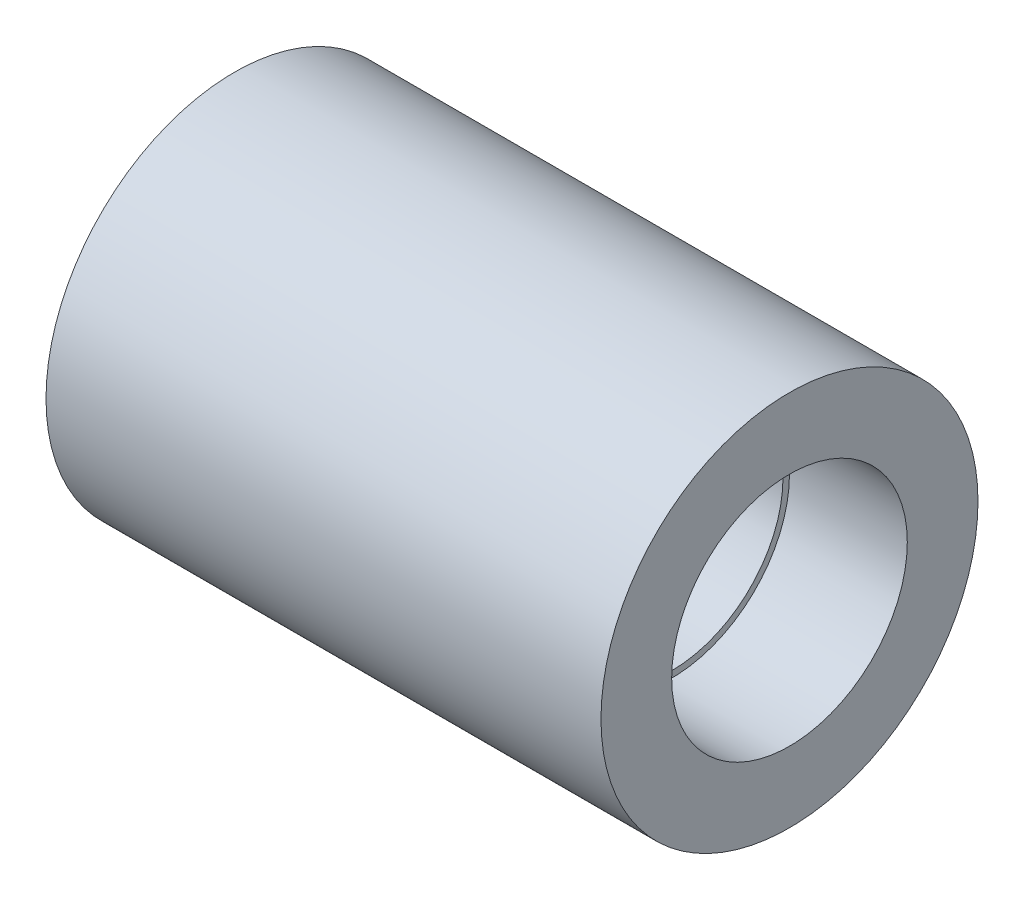
ISO-10303-21;
HEADER;
FILE_DESCRIPTION(('STEP AP214'),'2;1');
FILE_NAME('part.step','',(''),(''),'','','');
FILE_SCHEMA(('AUTOMOTIVE_DESIGN { 1 0 10303 214 1 1 1 1 }'));
ENDSEC;
DATA;
#1=APPLICATION_CONTEXT('core data for automotive mechanical design processes');
#2=APPLICATION_PROTOCOL_DEFINITION('international standard','automotive_design',2000,#1);
#3=PRODUCT_CONTEXT('',#1,'mechanical');
#4=PRODUCT('Part','Part','',(#3));
#5=PRODUCT_RELATED_PRODUCT_CATEGORY('part','',(#4));
#6=PRODUCT_DEFINITION_FORMATION('','',#4);
#7=PRODUCT_DEFINITION_CONTEXT('part definition',#1,'design');
#8=PRODUCT_DEFINITION('design','',#6,#7);
#9=PRODUCT_DEFINITION_SHAPE('','',#8);
#10=(LENGTH_UNIT() NAMED_UNIT(*) SI_UNIT(.MILLI.,.METRE.));
#11=(NAMED_UNIT(*) PLANE_ANGLE_UNIT() SI_UNIT($,.RADIAN.));
#12=(NAMED_UNIT(*) SI_UNIT($,.STERADIAN.) SOLID_ANGLE_UNIT());
#13=UNCERTAINTY_MEASURE_WITH_UNIT(LENGTH_MEASURE(1.E-05),#10,'distance_accuracy_value','');
#14=(GEOMETRIC_REPRESENTATION_CONTEXT(3) GLOBAL_UNCERTAINTY_ASSIGNED_CONTEXT((#13)) GLOBAL_UNIT_ASSIGNED_CONTEXT((#10,
#11,#12)) REPRESENTATION_CONTEXT('',''));
#15=CARTESIAN_POINT('',(0.,0.,0.));
#16=DIRECTION('',(0.,0.,1.));
#17=DIRECTION('',(1.,0.,0.));
#18=AXIS2_PLACEMENT_3D('',#15,#16,#17);
#19=CARTESIAN_POINT('',(3.175,0.,0.));
#20=DIRECTION('',(-1.,0.,0.));
#21=DIRECTION('',(0.,0.,1.));
#22=AXIS2_PLACEMENT_3D('',#19,#20,#21);
#23=CYLINDRICAL_SURFACE('',#22,3.175);
#24=CARTESIAN_POINT('',(3.175,0.,0.));
#25=DIRECTION('',(1.,0.,0.));
#26=DIRECTION('',(0.,0.,-1.));
#27=AXIS2_PLACEMENT_3D('',#24,#25,#26);
#28=CIRCLE('',#27,3.175);
#29=CARTESIAN_POINT('',(3.175,0.,-3.175));
#30=VERTEX_POINT('',#29);
#31=EDGE_CURVE('E46',#30,#30,#28,.T.);
#32=ORIENTED_EDGE('',*,*,#31,.T.);
#33=EDGE_LOOP('',(#32));
#34=FACE_BOUND('',#33,.T.);
#35=CARTESIAN_POINT('',(0.,0.,0.));
#36=DIRECTION('',(1.,0.,0.));
#37=DIRECTION('',(0.,0.,-1.));
#38=AXIS2_PLACEMENT_3D('',#35,#36,#37);
#39=CIRCLE('',#38,3.175);
#40=CARTESIAN_POINT('',(0.,0.,-3.175));
#41=VERTEX_POINT('',#40);
#42=EDGE_CURVE('E45',#41,#41,#39,.T.);
#43=ORIENTED_EDGE('',*,*,#42,.F.);
#44=EDGE_LOOP('',(#43));
#45=FACE_BOUND('',#44,.T.);
#46=ADVANCED_FACE('F39',(#34,#45),#23,.F.);
#47=CARTESIAN_POINT('',(3.175,0.,0.));
#48=DIRECTION('',(-1.,0.,0.));
#49=DIRECTION('',(0.,0.,1.));
#50=AXIS2_PLACEMENT_3D('',#47,#48,#49);
#51=CYLINDRICAL_SURFACE('',#50,5.08);
#52=CARTESIAN_POINT('',(3.175,0.,0.));
#53=DIRECTION('',(1.,0.,0.));
#54=DIRECTION('',(0.,0.,-1.));
#55=AXIS2_PLACEMENT_3D('',#52,#53,#54);
#56=CIRCLE('',#55,5.08);
#57=CARTESIAN_POINT('',(3.175,0.,-5.08));
#58=VERTEX_POINT('',#57);
#59=EDGE_CURVE('E10',#58,#58,#56,.T.);
#60=ORIENTED_EDGE('',*,*,#59,.F.);
#61=EDGE_LOOP('',(#60));
#62=FACE_BOUND('',#61,.T.);
#63=CARTESIAN_POINT('',(-11.7800000112,0.,0.));
#64=DIRECTION('',(1.,0.,0.));
#65=DIRECTION('',(0.,0.,-1.));
#66=AXIS2_PLACEMENT_3D('',#63,#64,#65);
#67=CIRCLE('',#66,5.08);
#68=CARTESIAN_POINT('',(-11.7800000112,0.,-5.08));
#69=VERTEX_POINT('',#68);
#70=EDGE_CURVE('E57',#69,#69,#67,.T.);
#71=ORIENTED_EDGE('',*,*,#70,.T.);
#72=EDGE_LOOP('',(#71));
#73=FACE_BOUND('',#72,.T.);
#74=ADVANCED_FACE('F78',(#62,#73),#51,.T.);
#75=CARTESIAN_POINT('',(3.175,0.,0.));
#76=DIRECTION('',(1.,0.,0.));
#77=DIRECTION('',(0.,0.,-1.));
#78=AXIS2_PLACEMENT_3D('',#75,#76,#77);
#79=PLANE('',#78);
#80=ORIENTED_EDGE('',*,*,#31,.F.);
#81=EDGE_LOOP('',(#80));
#82=FACE_BOUND('',#81,.T.);
#83=ORIENTED_EDGE('',*,*,#59,.T.);
#84=EDGE_LOOP('',(#83));
#85=FACE_BOUND('',#84,.T.);
#86=ADVANCED_FACE('F74',(#82,#85),#79,.T.);
#87=CARTESIAN_POINT('',(0.,0.,0.));
#88=DIRECTION('',(1.,0.,0.));
#89=DIRECTION('',(0.,0.,-1.));
#90=AXIS2_PLACEMENT_3D('',#87,#88,#89);
#91=PLANE('',#90);
#92=CARTESIAN_POINT('',(0.,0.,0.));
#93=DIRECTION('',(1.,0.,0.));
#94=DIRECTION('',(0.,0.,-1.));
#95=AXIS2_PLACEMENT_3D('',#92,#93,#94);
#96=CIRCLE('',#95,3.);
#97=CARTESIAN_POINT('',(0.,0.,-3.));
#98=VERTEX_POINT('',#97);
#99=EDGE_CURVE('E55',#98,#98,#96,.T.);
#100=ORIENTED_EDGE('',*,*,#99,.F.);
#101=EDGE_LOOP('',(#100));
#102=FACE_BOUND('',#101,.T.);
#103=ORIENTED_EDGE('',*,*,#42,.T.);
#104=EDGE_LOOP('',(#103));
#105=FACE_BOUND('',#104,.T.);
#106=ADVANCED_FACE('F69',(#102,#105),#91,.T.);
#107=CARTESIAN_POINT('',(-11.7800000112,0.,0.));
#108=DIRECTION('',(1.,0.,0.));
#109=DIRECTION('',(0.,0.,-1.));
#110=AXIS2_PLACEMENT_3D('',#107,#108,#109);
#111=CYLINDRICAL_SURFACE('',#110,3.);
#112=CARTESIAN_POINT('',(-11.7800000112,0.,0.));
#113=DIRECTION('',(1.,0.,0.));
#114=DIRECTION('',(0.,0.,-1.));
#115=AXIS2_PLACEMENT_3D('',#112,#113,#114);
#116=CIRCLE('',#115,3.);
#117=CARTESIAN_POINT('',(-11.7800000112,0.,-3.));
#118=VERTEX_POINT('',#117);
#119=EDGE_CURVE('E54',#118,#118,#116,.T.);
#120=ORIENTED_EDGE('',*,*,#119,.F.);
#121=EDGE_LOOP('',(#120));
#122=FACE_BOUND('',#121,.T.);
#123=ORIENTED_EDGE('',*,*,#99,.T.);
#124=EDGE_LOOP('',(#123));
#125=FACE_BOUND('',#124,.T.);
#126=ADVANCED_FACE('F63',(#122,#125),#111,.F.);
#127=CARTESIAN_POINT('',(-11.7800000112,0.,0.));
#128=DIRECTION('',(1.,0.,0.));
#129=DIRECTION('',(0.,0.,-1.));
#130=AXIS2_PLACEMENT_3D('',#127,#128,#129);
#131=PLANE('',#130);
#132=ORIENTED_EDGE('',*,*,#119,.T.);
#133=EDGE_LOOP('',(#132));
#134=FACE_BOUND('',#133,.T.);
#135=ORIENTED_EDGE('',*,*,#70,.F.);
#136=EDGE_LOOP('',(#135));
#137=FACE_BOUND('',#136,.T.);
#138=ADVANCED_FACE('F65',(#134,#137),#131,.F.);
#139=CLOSED_SHELL('',(#46,#74,#86,#106,#126,#138));
#140=MANIFOLD_SOLID_BREP('B2',#139);
#141=ADVANCED_BREP_SHAPE_REPRESENTATION('',(#18,#140),#14);
#142=SHAPE_DEFINITION_REPRESENTATION(#9,#141);
ENDSEC;
END-ISO-10303-21;
